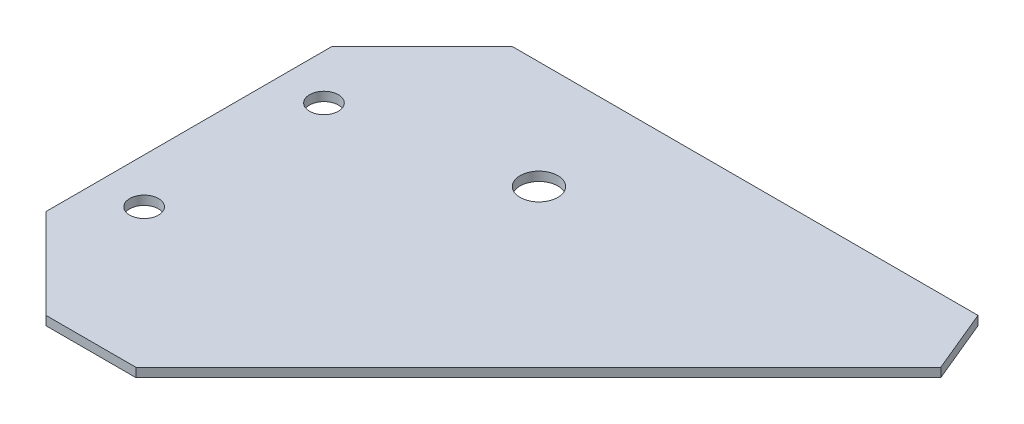
ISO-10303-21;
HEADER;
FILE_DESCRIPTION(('STEP AP214'),'2;1');
FILE_NAME('part.step','',(''),(''),'','','');
FILE_SCHEMA(('AUTOMOTIVE_DESIGN { 1 0 10303 214 1 1 1 1 }'));
ENDSEC;
DATA;
#1=APPLICATION_CONTEXT('core data for automotive mechanical design processes');
#2=APPLICATION_PROTOCOL_DEFINITION('international standard','automotive_design',2000,#1);
#3=PRODUCT_CONTEXT('',#1,'mechanical');
#4=PRODUCT('Part','Part','',(#3));
#5=PRODUCT_RELATED_PRODUCT_CATEGORY('part','',(#4));
#6=PRODUCT_DEFINITION_FORMATION('','',#4);
#7=PRODUCT_DEFINITION_CONTEXT('part definition',#1,'design');
#8=PRODUCT_DEFINITION('design','',#6,#7);
#9=PRODUCT_DEFINITION_SHAPE('','',#8);
#10=(LENGTH_UNIT() NAMED_UNIT(*) SI_UNIT(.MILLI.,.METRE.));
#11=(NAMED_UNIT(*) PLANE_ANGLE_UNIT() SI_UNIT($,.RADIAN.));
#12=(NAMED_UNIT(*) SI_UNIT($,.STERADIAN.) SOLID_ANGLE_UNIT());
#13=UNCERTAINTY_MEASURE_WITH_UNIT(LENGTH_MEASURE(1.E-05),#10,'distance_accuracy_value','');
#14=(GEOMETRIC_REPRESENTATION_CONTEXT(3) GLOBAL_UNCERTAINTY_ASSIGNED_CONTEXT((#13)) GLOBAL_UNIT_ASSIGNED_CONTEXT((#10,
#11,#12)) REPRESENTATION_CONTEXT('',''));
#15=CARTESIAN_POINT('',(0.,0.,0.));
#16=DIRECTION('',(0.,0.,1.));
#17=DIRECTION('',(1.,0.,0.));
#18=AXIS2_PLACEMENT_3D('',#15,#16,#17);
#19=CARTESIAN_POINT('',(0.,1.,0.));
#20=DIRECTION('',(-1.,0.,0.));
#21=DIRECTION('',(0.,0.,1.));
#22=AXIS2_PLACEMENT_3D('',#19,#20,#21);
#23=PLANE('',#22);
#24=DIRECTION('',(0.,0.,-1.));
#25=VECTOR('',#24,1.);
#26=CARTESIAN_POINT('',(0.,1.,0.));
#27=LINE('',#26,#25);
#28=CARTESIAN_POINT('',(0.,1.,9.99999999999996));
#29=VERTEX_POINT('',#28);
#30=CARTESIAN_POINT('',(0.,1.,-21.8198051533946));
#31=VERTEX_POINT('',#30);
#32=EDGE_CURVE('E116',#29,#31,#27,.T.);
#33=ORIENTED_EDGE('',*,*,#32,.T.);
#34=DIRECTION('',(0.,-1.,0.));
#35=VECTOR('',#34,1.);
#36=CARTESIAN_POINT('',(0.,1.,-21.8198051533946));
#37=LINE('',#36,#35);
#38=CARTESIAN_POINT('',(0.,0.,-21.8198051533946));
#39=VERTEX_POINT('',#38);
#40=EDGE_CURVE('E147',#31,#39,#37,.T.);
#41=ORIENTED_EDGE('',*,*,#40,.T.);
#42=DIRECTION('',(0.,0.,-1.));
#43=VECTOR('',#42,1.);
#44=CARTESIAN_POINT('',(0.,0.,0.));
#45=LINE('',#44,#43);
#46=CARTESIAN_POINT('',(0.,0.,9.99999999999996));
#47=VERTEX_POINT('',#46);
#48=EDGE_CURVE('E129',#47,#39,#45,.T.);
#49=ORIENTED_EDGE('',*,*,#48,.F.);
#50=DIRECTION('',(0.,1.,0.));
#51=VECTOR('',#50,1.);
#52=CARTESIAN_POINT('',(0.,1.,9.99999999999996));
#53=LINE('',#52,#51);
#54=EDGE_CURVE('E144',#47,#29,#53,.T.);
#55=ORIENTED_EDGE('',*,*,#54,.T.);
#56=EDGE_LOOP('',(#33,#41,#49,#55));
#57=FACE_BOUND('',#56,.T.);
#58=ADVANCED_FACE('F44',(#57),#23,.T.);
#59=CARTESIAN_POINT('',(0.,1.,20.));
#60=DIRECTION('',(0.,0.,-1.));
#61=DIRECTION('',(-1.,0.,0.));
#62=AXIS2_PLACEMENT_3D('',#59,#60,#61);
#63=PLANE('',#62);
#64=DIRECTION('',(1.,0.,0.));
#65=VECTOR('',#64,1.);
#66=CARTESIAN_POINT('',(0.,1.,20.));
#67=LINE('',#66,#65);
#68=CARTESIAN_POINT('',(10.,1.,20.));
#69=VERTEX_POINT('',#68);
#70=CARTESIAN_POINT('',(20.0000000000007,1.,20.));
#71=VERTEX_POINT('',#70);
#72=EDGE_CURVE('E110',#69,#71,#67,.T.);
#73=ORIENTED_EDGE('',*,*,#72,.F.);
#74=DIRECTION('',(0.,-1.,0.));
#75=VECTOR('',#74,1.);
#76=CARTESIAN_POINT('',(10.,0.,20.));
#77=LINE('',#76,#75);
#78=CARTESIAN_POINT('',(10.,0.,20.));
#79=VERTEX_POINT('',#78);
#80=EDGE_CURVE('E11',#69,#79,#77,.T.);
#81=ORIENTED_EDGE('',*,*,#80,.T.);
#82=DIRECTION('',(1.,0.,0.));
#83=VECTOR('',#82,1.);
#84=CARTESIAN_POINT('',(0.,0.,20.));
#85=LINE('',#84,#83);
#86=CARTESIAN_POINT('',(20.0000000000007,0.,20.));
#87=VERTEX_POINT('',#86);
#88=EDGE_CURVE('E127',#79,#87,#85,.T.);
#89=ORIENTED_EDGE('',*,*,#88,.T.);
#90=DIRECTION('',(0.,1.,0.));
#91=VECTOR('',#90,1.);
#92=CARTESIAN_POINT('',(20.0000000000007,-9.,20.));
#93=LINE('',#92,#91);
#94=EDGE_CURVE('E125',#87,#71,#93,.T.);
#95=ORIENTED_EDGE('',*,*,#94,.T.);
#96=EDGE_LOOP('',(#73,#81,#89,#95));
#97=FACE_BOUND('',#96,.T.);
#98=ADVANCED_FACE('F121',(#97),#63,.F.);
#99=CARTESIAN_POINT('',(0.,1.,-31.8198051533946));
#100=DIRECTION('',(0.,0.,-1.));
#101=DIRECTION('',(-1.,0.,0.));
#102=AXIS2_PLACEMENT_3D('',#99,#100,#101);
#103=PLANE('',#102);
#104=DIRECTION('',(1.,0.,0.));
#105=VECTOR('',#104,1.);
#106=CARTESIAN_POINT('',(0.,0.,-31.8198051533946));
#107=LINE('',#106,#105);
#108=CARTESIAN_POINT('',(10.,0.,-31.8198051533946));
#109=VERTEX_POINT('',#108);
#110=CARTESIAN_POINT('',(61.8198051533947,0.,-31.8198051533946));
#111=VERTEX_POINT('',#110);
#112=EDGE_CURVE('E132',#109,#111,#107,.T.);
#113=ORIENTED_EDGE('',*,*,#112,.F.);
#114=DIRECTION('',(0.,1.,0.));
#115=VECTOR('',#114,1.);
#116=CARTESIAN_POINT('',(10.,1.,-31.8198051533946));
#117=LINE('',#116,#115);
#118=CARTESIAN_POINT('',(10.,1.,-31.8198051533946));
#119=VERTEX_POINT('',#118);
#120=EDGE_CURVE('E159',#109,#119,#117,.T.);
#121=ORIENTED_EDGE('',*,*,#120,.T.);
#122=DIRECTION('',(1.,0.,0.));
#123=VECTOR('',#122,1.);
#124=CARTESIAN_POINT('',(0.,1.,-31.8198051533946));
#125=LINE('',#124,#123);
#126=CARTESIAN_POINT('',(61.8198051533947,1.,-31.8198051533946));
#127=VERTEX_POINT('',#126);
#128=EDGE_CURVE('E114',#119,#127,#125,.T.);
#129=ORIENTED_EDGE('',*,*,#128,.T.);
#130=DIRECTION('',(0.,-1.,0.));
#131=VECTOR('',#130,1.);
#132=CARTESIAN_POINT('',(61.8198051533947,0.,-31.8198051533946));
#133=LINE('',#132,#131);
#134=EDGE_CURVE('E152',#127,#111,#133,.T.);
#135=ORIENTED_EDGE('',*,*,#134,.T.);
#136=EDGE_LOOP('',(#113,#121,#129,#135));
#137=FACE_BOUND('',#136,.T.);
#138=ADVANCED_FACE('F193',(#137),#103,.T.);
#139=CARTESIAN_POINT('',(0.,1.,0.));
#140=DIRECTION('',(0.,1.,0.));
#141=DIRECTION('',(0.,0.,1.));
#142=AXIS2_PLACEMENT_3D('',#139,#140,#141);
#143=PLANE('',#142);
#144=CARTESIAN_POINT('',(25.,1.,-19.8198051533946));
#145=DIRECTION('',(0.,1.,0.));
#146=DIRECTION('',(0.,0.,1.));
#147=AXIS2_PLACEMENT_3D('',#144,#145,#146);
#148=CIRCLE('',#147,2.1);
#149=CARTESIAN_POINT('',(25.,1.,-17.7198051533946));
#150=VERTEX_POINT('',#149);
#151=EDGE_CURVE('E244',#150,#150,#148,.T.);
#152=ORIENTED_EDGE('',*,*,#151,.F.);
#153=EDGE_LOOP('',(#152));
#154=FACE_BOUND('',#153,.T.);
#155=CARTESIAN_POINT('',(5.,1.,4.09009742330268));
#156=DIRECTION('',(0.,1.,0.));
#157=DIRECTION('',(0.,0.,1.));
#158=AXIS2_PLACEMENT_3D('',#155,#156,#157);
#159=CIRCLE('',#158,1.6);
#160=CARTESIAN_POINT('',(5.,1.,5.69009742330268));
#161=VERTEX_POINT('',#160);
#162=EDGE_CURVE('E243',#161,#161,#159,.T.);
#163=ORIENTED_EDGE('',*,*,#162,.F.);
#164=EDGE_LOOP('',(#163));
#165=FACE_BOUND('',#164,.T.);
#166=CARTESIAN_POINT('',(5.,1.,-15.9099025766973));
#167=DIRECTION('',(0.,1.,0.));
#168=DIRECTION('',(0.,0.,1.));
#169=AXIS2_PLACEMENT_3D('',#166,#167,#168);
#170=CIRCLE('',#169,1.6);
#171=CARTESIAN_POINT('',(5.,1.,-14.3099025766973));
#172=VERTEX_POINT('',#171);
#173=EDGE_CURVE('E170',#172,#172,#170,.T.);
#174=ORIENTED_EDGE('',*,*,#173,.F.);
#175=EDGE_LOOP('',(#174));
#176=FACE_BOUND('',#175,.T.);
#177=ORIENTED_EDGE('',*,*,#128,.F.);
#178=DIRECTION('',(0.707106781186548,0.,-0.707106781186548));
#179=VECTOR('',#178,1.);
#180=CARTESIAN_POINT('',(-10.9099025766973,1.,-10.9099025766973));
#181=LINE('',#180,#179);
#182=EDGE_CURVE('E163',#119,#31,#181,.F.);
#183=ORIENTED_EDGE('',*,*,#182,.T.);
#184=ORIENTED_EDGE('',*,*,#32,.F.);
#185=DIRECTION('',(0.707106781186548,0.,0.707106781186547));
#186=VECTOR('',#185,1.);
#187=CARTESIAN_POINT('',(-4.99999999999998,1.,4.99999999999999));
#188=LINE('',#187,#186);
#189=EDGE_CURVE('E64',#29,#69,#188,.T.);
#190=ORIENTED_EDGE('',*,*,#189,.T.);
#191=ORIENTED_EDGE('',*,*,#72,.T.);
#192=DIRECTION('',(-0.707106781186543,0.,0.707106781186552));
#193=VECTOR('',#192,1.);
#194=CARTESIAN_POINT('',(80.,1.,-40.));
#195=LINE('',#194,#193);
#196=CARTESIAN_POINT('',(64.7487373415292,1.,-24.7487373415291));
#197=VERTEX_POINT('',#196);
#198=EDGE_CURVE('E111',#197,#71,#195,.T.);
#199=ORIENTED_EDGE('',*,*,#198,.F.);
#200=DIRECTION('',(-0.38268343236509,0.,-0.923879532511287));
#201=VECTOR('',#200,1.);
#202=CARTESIAN_POINT('',(64.0165042944956,1.,-26.5165042944955));
#203=LINE('',#202,#201);
#204=EDGE_CURVE('E73',#197,#127,#203,.T.);
#205=ORIENTED_EDGE('',*,*,#204,.T.);
#206=EDGE_LOOP('',(#177,#183,#184,#190,#191,#199,#205));
#207=FACE_BOUND('',#206,.T.);
#208=ADVANCED_FACE('F109',(#154,#165,#176,#207),#143,.T.);
#209=CARTESIAN_POINT('',(0.,0.,0.));
#210=DIRECTION('',(0.,1.,0.));
#211=DIRECTION('',(0.,0.,1.));
#212=AXIS2_PLACEMENT_3D('',#209,#210,#211);
#213=PLANE('',#212);
#214=CARTESIAN_POINT('',(25.,0.,-19.8198051533946));
#215=DIRECTION('',(0.,1.,0.));
#216=DIRECTION('',(0.,0.,1.));
#217=AXIS2_PLACEMENT_3D('',#214,#215,#216);
#218=CIRCLE('',#217,2.1);
#219=CARTESIAN_POINT('',(25.,0.,-17.7198051533946));
#220=VERTEX_POINT('',#219);
#221=EDGE_CURVE('E49',#220,#220,#218,.T.);
#222=ORIENTED_EDGE('',*,*,#221,.T.);
#223=EDGE_LOOP('',(#222));
#224=FACE_BOUND('',#223,.T.);
#225=CARTESIAN_POINT('',(5.,0.,4.09009742330268));
#226=DIRECTION('',(0.,1.,0.));
#227=DIRECTION('',(0.,0.,1.));
#228=AXIS2_PLACEMENT_3D('',#225,#226,#227);
#229=CIRCLE('',#228,1.6);
#230=CARTESIAN_POINT('',(5.,0.,5.69009742330268));
#231=VERTEX_POINT('',#230);
#232=EDGE_CURVE('E168',#231,#231,#229,.T.);
#233=ORIENTED_EDGE('',*,*,#232,.T.);
#234=EDGE_LOOP('',(#233));
#235=FACE_BOUND('',#234,.T.);
#236=CARTESIAN_POINT('',(5.,0.,-15.9099025766973));
#237=DIRECTION('',(0.,1.,0.));
#238=DIRECTION('',(0.,0.,1.));
#239=AXIS2_PLACEMENT_3D('',#236,#237,#238);
#240=CIRCLE('',#239,1.6);
#241=CARTESIAN_POINT('',(5.,0.,-14.3099025766973));
#242=VERTEX_POINT('',#241);
#243=EDGE_CURVE('E165',#242,#242,#240,.T.);
#244=ORIENTED_EDGE('',*,*,#243,.T.);
#245=EDGE_LOOP('',(#244));
#246=FACE_BOUND('',#245,.T.);
#247=ORIENTED_EDGE('',*,*,#48,.T.);
#248=DIRECTION('',(-0.707106781186548,0.,0.707106781186548));
#249=VECTOR('',#248,1.);
#250=CARTESIAN_POINT('',(0.,0.,-21.8198051533946));
#251=LINE('',#250,#249);
#252=EDGE_CURVE('E155',#39,#109,#251,.F.);
#253=ORIENTED_EDGE('',*,*,#252,.T.);
#254=ORIENTED_EDGE('',*,*,#112,.T.);
#255=DIRECTION('',(0.38268343236509,0.,0.923879532511287));
#256=VECTOR('',#255,1.);
#257=CARTESIAN_POINT('',(64.7487373415292,0.,-24.7487373415291));
#258=LINE('',#257,#256);
#259=CARTESIAN_POINT('',(64.7487373415292,0.,-24.7487373415291));
#260=VERTEX_POINT('',#259);
#261=EDGE_CURVE('E154',#111,#260,#258,.T.);
#262=ORIENTED_EDGE('',*,*,#261,.T.);
#263=DIRECTION('',(-0.707106781186543,0.,0.707106781186552));
#264=VECTOR('',#263,1.);
#265=CARTESIAN_POINT('',(20.0000000000005,0.,20.0000000000002));
#266=LINE('',#265,#264);
#267=EDGE_CURVE('E137',#260,#87,#266,.T.);
#268=ORIENTED_EDGE('',*,*,#267,.T.);
#269=ORIENTED_EDGE('',*,*,#88,.F.);
#270=DIRECTION('',(-0.707106781186548,0.,-0.707106781186547));
#271=VECTOR('',#270,1.);
#272=CARTESIAN_POINT('',(10.,0.,20.));
#273=LINE('',#272,#271);
#274=EDGE_CURVE('E146',#79,#47,#273,.T.);
#275=ORIENTED_EDGE('',*,*,#274,.T.);
#276=EDGE_LOOP('',(#247,#253,#254,#262,#268,#269,#275));
#277=FACE_BOUND('',#276,.T.);
#278=ADVANCED_FACE('F172',(#224,#235,#246,#277),#213,.F.);
#279=CARTESIAN_POINT('',(80.,-9.,-40.));
#280=DIRECTION('',(-0.707106781186552,0.,-0.707106781186543));
#281=DIRECTION('',(-0.707106781186543,0.,0.707106781186552));
#282=AXIS2_PLACEMENT_3D('',#279,#280,#281);
#283=PLANE('',#282);
#284=ORIENTED_EDGE('',*,*,#267,.F.);
#285=DIRECTION('',(0.,1.,0.));
#286=VECTOR('',#285,1.);
#287=CARTESIAN_POINT('',(64.7487373415292,1.,-24.7487373415291));
#288=LINE('',#287,#286);
#289=EDGE_CURVE('E54',#260,#197,#288,.T.);
#290=ORIENTED_EDGE('',*,*,#289,.T.);
#291=ORIENTED_EDGE('',*,*,#198,.T.);
#292=ORIENTED_EDGE('',*,*,#94,.F.);
#293=EDGE_LOOP('',(#284,#290,#291,#292));
#294=FACE_BOUND('',#293,.T.);
#295=ADVANCED_FACE('F122',(#294),#283,.F.);
#296=CARTESIAN_POINT('',(0.,1.,-21.8198051533946));
#297=DIRECTION('',(0.707106781186547,0.,0.707106781186547));
#298=DIRECTION('',(0.,-1.,0.));
#299=AXIS2_PLACEMENT_3D('',#296,#297,#298);
#300=PLANE('',#299);
#301=ORIENTED_EDGE('',*,*,#182,.F.);
#302=ORIENTED_EDGE('',*,*,#120,.F.);
#303=ORIENTED_EDGE('',*,*,#252,.F.);
#304=ORIENTED_EDGE('',*,*,#40,.F.);
#305=EDGE_LOOP('',(#301,#302,#303,#304));
#306=FACE_BOUND('',#305,.T.);
#307=ADVANCED_FACE('F197',(#306),#300,.F.);
#308=CARTESIAN_POINT('',(64.7487373415292,-9.,-24.7487373415291));
#309=DIRECTION('',(0.923879532511287,0.,-0.382683432365089));
#310=DIRECTION('',(0.,-1.,0.));
#311=AXIS2_PLACEMENT_3D('',#308,#309,#310);
#312=PLANE('',#311);
#313=ORIENTED_EDGE('',*,*,#261,.F.);
#314=ORIENTED_EDGE('',*,*,#134,.F.);
#315=ORIENTED_EDGE('',*,*,#204,.F.);
#316=ORIENTED_EDGE('',*,*,#289,.F.);
#317=EDGE_LOOP('',(#313,#314,#315,#316));
#318=FACE_BOUND('',#317,.T.);
#319=ADVANCED_FACE('F201',(#318),#312,.T.);
#320=CARTESIAN_POINT('',(10.,1.,20.));
#321=DIRECTION('',(-0.707106781186547,0.,0.707106781186548));
#322=DIRECTION('',(0.,1.,0.));
#323=AXIS2_PLACEMENT_3D('',#320,#321,#322);
#324=PLANE('',#323);
#325=ORIENTED_EDGE('',*,*,#189,.F.);
#326=ORIENTED_EDGE('',*,*,#54,.F.);
#327=ORIENTED_EDGE('',*,*,#274,.F.);
#328=ORIENTED_EDGE('',*,*,#80,.F.);
#329=EDGE_LOOP('',(#325,#326,#327,#328));
#330=FACE_BOUND('',#329,.T.);
#331=ADVANCED_FACE('F48',(#330),#324,.T.);
#332=CARTESIAN_POINT('',(5.,-9.,-15.9099025766973));
#333=DIRECTION('',(0.,1.,0.));
#334=DIRECTION('',(0.,0.,1.));
#335=AXIS2_PLACEMENT_3D('',#332,#333,#334);
#336=CYLINDRICAL_SURFACE('',#335,1.6);
#337=ORIENTED_EDGE('',*,*,#173,.T.);
#338=EDGE_LOOP('',(#337));
#339=FACE_BOUND('',#338,.T.);
#340=ORIENTED_EDGE('',*,*,#243,.F.);
#341=EDGE_LOOP('',(#340));
#342=FACE_BOUND('',#341,.T.);
#343=ADVANCED_FACE('F183',(#339,#342),#336,.F.);
#344=CARTESIAN_POINT('',(5.,-9.,4.09009742330268));
#345=DIRECTION('',(0.,1.,0.));
#346=DIRECTION('',(0.,0.,1.));
#347=AXIS2_PLACEMENT_3D('',#344,#345,#346);
#348=CYLINDRICAL_SURFACE('',#347,1.6);
#349=ORIENTED_EDGE('',*,*,#162,.T.);
#350=EDGE_LOOP('',(#349));
#351=FACE_BOUND('',#350,.T.);
#352=ORIENTED_EDGE('',*,*,#232,.F.);
#353=EDGE_LOOP('',(#352));
#354=FACE_BOUND('',#353,.T.);
#355=ADVANCED_FACE('F178',(#351,#354),#348,.F.);
#356=CARTESIAN_POINT('',(25.,-9.,-19.8198051533946));
#357=DIRECTION('',(0.,1.,0.));
#358=DIRECTION('',(0.,0.,1.));
#359=AXIS2_PLACEMENT_3D('',#356,#357,#358);
#360=CYLINDRICAL_SURFACE('',#359,2.1);
#361=ORIENTED_EDGE('',*,*,#151,.T.);
#362=EDGE_LOOP('',(#361));
#363=FACE_BOUND('',#362,.T.);
#364=ORIENTED_EDGE('',*,*,#221,.F.);
#365=EDGE_LOOP('',(#364));
#366=FACE_BOUND('',#365,.T.);
#367=ADVANCED_FACE('F176',(#363,#366),#360,.F.);
#368=CLOSED_SHELL('',(#58,#98,#138,#208,#278,#295,#307,#319,#331,#343,#355,#367));
#369=MANIFOLD_SOLID_BREP('B2',#368);
#370=ADVANCED_BREP_SHAPE_REPRESENTATION('',(#18,#369),#14);
#371=SHAPE_DEFINITION_REPRESENTATION(#9,#370);
ENDSEC;
END-ISO-10303-21;
